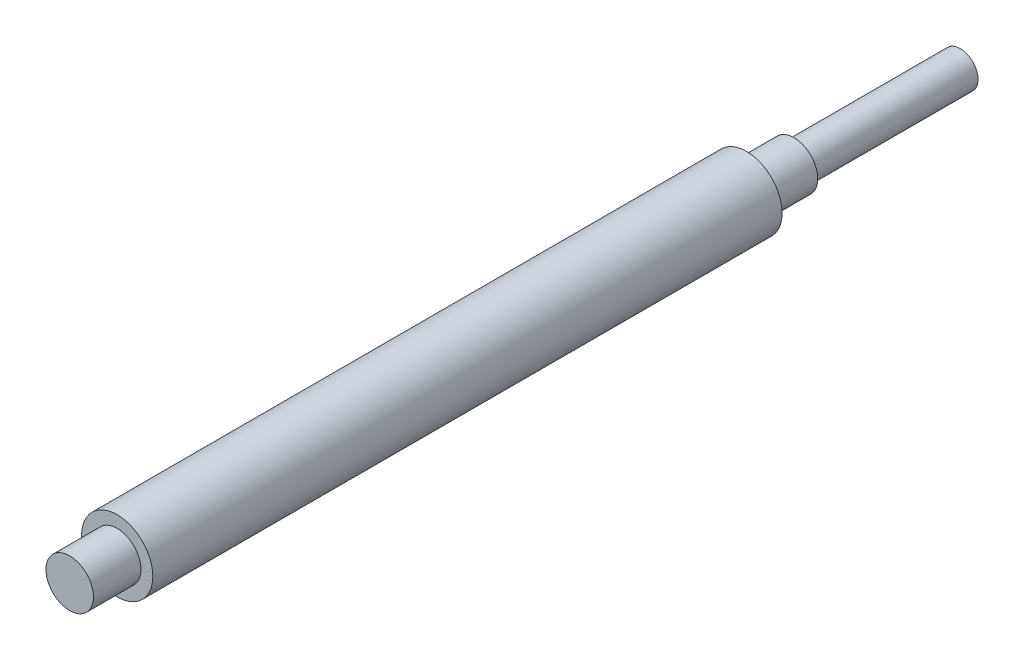
ISO-10303-21;
HEADER;
FILE_DESCRIPTION(('STEP AP214'),'2;1');
FILE_NAME('part.step','',(''),(''),'','','');
FILE_SCHEMA(('AUTOMOTIVE_DESIGN { 1 0 10303 214 1 1 1 1 }'));
ENDSEC;
DATA;
#1=APPLICATION_CONTEXT('core data for automotive mechanical design processes');
#2=APPLICATION_PROTOCOL_DEFINITION('international standard','automotive_design',2000,#1);
#3=PRODUCT_CONTEXT('',#1,'mechanical');
#4=PRODUCT('Part','Part','',(#3));
#5=PRODUCT_RELATED_PRODUCT_CATEGORY('part','',(#4));
#6=PRODUCT_DEFINITION_FORMATION('','',#4);
#7=PRODUCT_DEFINITION_CONTEXT('part definition',#1,'design');
#8=PRODUCT_DEFINITION('design','',#6,#7);
#9=PRODUCT_DEFINITION_SHAPE('','',#8);
#10=(LENGTH_UNIT() NAMED_UNIT(*) SI_UNIT(.MILLI.,.METRE.));
#11=(NAMED_UNIT(*) PLANE_ANGLE_UNIT() SI_UNIT($,.RADIAN.));
#12=(NAMED_UNIT(*) SI_UNIT($,.STERADIAN.) SOLID_ANGLE_UNIT());
#13=UNCERTAINTY_MEASURE_WITH_UNIT(LENGTH_MEASURE(1.E-05),#10,'distance_accuracy_value','');
#14=(GEOMETRIC_REPRESENTATION_CONTEXT(3) GLOBAL_UNCERTAINTY_ASSIGNED_CONTEXT((#13)) GLOBAL_UNIT_ASSIGNED_CONTEXT((#10,
#11,#12)) REPRESENTATION_CONTEXT('',''));
#15=CARTESIAN_POINT('',(0.,0.,0.));
#16=DIRECTION('',(0.,0.,1.));
#17=DIRECTION('',(1.,0.,0.));
#18=AXIS2_PLACEMENT_3D('',#15,#16,#17);
#19=CARTESIAN_POINT('',(0.,0.,75.));
#20=DIRECTION('',(0.,0.,-1.));
#21=DIRECTION('',(-1.,0.,0.));
#22=AXIS2_PLACEMENT_3D('',#19,#20,#21);
#23=CYLINDRICAL_SURFACE('',#22,3.);
#24=CARTESIAN_POINT('',(0.,0.,18.));
#25=DIRECTION('',(0.,0.,1.));
#26=DIRECTION('',(1.,0.,0.));
#27=AXIS2_PLACEMENT_3D('',#24,#25,#26);
#28=CIRCLE('',#27,3.);
#29=CARTESIAN_POINT('',(3.,0.,18.));
#30=VERTEX_POINT('',#29);
#31=EDGE_CURVE('E60',#30,#30,#28,.F.);
#32=ORIENTED_EDGE('',*,*,#31,.F.);
#33=EDGE_LOOP('',(#32));
#34=FACE_BOUND('',#33,.T.);
#35=CARTESIAN_POINT('',(0.,0.,71.));
#36=DIRECTION('',(0.,0.,1.));
#37=DIRECTION('',(1.,0.,0.));
#38=AXIS2_PLACEMENT_3D('',#35,#36,#37);
#39=CIRCLE('',#38,3.);
#40=CARTESIAN_POINT('',(3.,0.,71.));
#41=VERTEX_POINT('',#40);
#42=EDGE_CURVE('E12',#41,#41,#39,.T.);
#43=ORIENTED_EDGE('',*,*,#42,.F.);
#44=EDGE_LOOP('',(#43));
#45=FACE_BOUND('',#44,.T.);
#46=ADVANCED_FACE('F40',(#34,#45),#23,.T.);
#47=CARTESIAN_POINT('',(0.,0.,71.));
#48=DIRECTION('',(0.,0.,1.));
#49=DIRECTION('',(1.,0.,0.));
#50=AXIS2_PLACEMENT_3D('',#47,#48,#49);
#51=PLANE('',#50);
#52=CARTESIAN_POINT('',(0.,0.,71.));
#53=DIRECTION('',(0.,0.,1.));
#54=DIRECTION('',(1.,0.,0.));
#55=AXIS2_PLACEMENT_3D('',#52,#53,#54);
#56=CIRCLE('',#55,2.);
#57=CARTESIAN_POINT('',(2.,0.,71.));
#58=VERTEX_POINT('',#57);
#59=EDGE_CURVE('E48',#58,#58,#56,.T.);
#60=ORIENTED_EDGE('',*,*,#59,.F.);
#61=EDGE_LOOP('',(#60));
#62=FACE_BOUND('',#61,.T.);
#63=ORIENTED_EDGE('',*,*,#42,.T.);
#64=EDGE_LOOP('',(#63));
#65=FACE_BOUND('',#64,.T.);
#66=ADVANCED_FACE('F95',(#62,#65),#51,.T.);
#67=CARTESIAN_POINT('',(0.,0.,71.));
#68=DIRECTION('',(0.,0.,1.));
#69=DIRECTION('',(1.,0.,0.));
#70=AXIS2_PLACEMENT_3D('',#67,#68,#69);
#71=CYLINDRICAL_SURFACE('',#70,2.);
#72=ORIENTED_EDGE('',*,*,#59,.T.);
#73=EDGE_LOOP('',(#72));
#74=FACE_BOUND('',#73,.T.);
#75=CARTESIAN_POINT('',(0.,0.,75.));
#76=DIRECTION('',(0.,0.,1.));
#77=DIRECTION('',(1.,0.,0.));
#78=AXIS2_PLACEMENT_3D('',#75,#76,#77);
#79=CIRCLE('',#78,2.);
#80=CARTESIAN_POINT('',(2.,0.,75.));
#81=VERTEX_POINT('',#80);
#82=EDGE_CURVE('E53',#81,#81,#79,.T.);
#83=ORIENTED_EDGE('',*,*,#82,.F.);
#84=EDGE_LOOP('',(#83));
#85=FACE_BOUND('',#84,.T.);
#86=ADVANCED_FACE('F100',(#74,#85),#71,.T.);
#87=CARTESIAN_POINT('',(0.,0.,75.));
#88=DIRECTION('',(0.,0.,1.));
#89=DIRECTION('',(1.,0.,0.));
#90=AXIS2_PLACEMENT_3D('',#87,#88,#89);
#91=PLANE('',#90);
#92=ORIENTED_EDGE('',*,*,#82,.T.);
#93=EDGE_LOOP('',(#92));
#94=FACE_BOUND('',#93,.T.);
#95=ADVANCED_FACE('F113',(#94),#91,.T.);
#96=CARTESIAN_POINT('',(0.,0.,79.4852813742386));
#97=DIRECTION('',(0.,0.,-1.));
#98=DIRECTION('',(-1.,0.,0.));
#99=AXIS2_PLACEMENT_3D('',#96,#97,#98);
#100=CYLINDRICAL_SURFACE('',#99,2.);
#101=CARTESIAN_POINT('',(0.,0.,14.));
#102=DIRECTION('',(0.,0.,1.));
#103=DIRECTION('',(1.,0.,0.));
#104=AXIS2_PLACEMENT_3D('',#101,#102,#103);
#105=CIRCLE('',#104,2.);
#106=CARTESIAN_POINT('',(2.,0.,14.));
#107=VERTEX_POINT('',#106);
#108=EDGE_CURVE('E43',#107,#107,#105,.F.);
#109=ORIENTED_EDGE('',*,*,#108,.F.);
#110=EDGE_LOOP('',(#109));
#111=FACE_BOUND('',#110,.T.);
#112=CARTESIAN_POINT('',(0.,0.,18.));
#113=DIRECTION('',(0.,0.,1.));
#114=DIRECTION('',(1.,0.,0.));
#115=AXIS2_PLACEMENT_3D('',#112,#113,#114);
#116=CIRCLE('',#115,2.);
#117=CARTESIAN_POINT('',(2.,0.,18.));
#118=VERTEX_POINT('',#117);
#119=EDGE_CURVE('E58',#118,#118,#116,.F.);
#120=ORIENTED_EDGE('',*,*,#119,.T.);
#121=EDGE_LOOP('',(#120));
#122=FACE_BOUND('',#121,.T.);
#123=ADVANCED_FACE('F108',(#111,#122),#100,.T.);
#124=CARTESIAN_POINT('',(0.,0.,18.));
#125=DIRECTION('',(0.,0.,1.));
#126=DIRECTION('',(1.,0.,0.));
#127=AXIS2_PLACEMENT_3D('',#124,#125,#126);
#128=PLANE('',#127);
#129=ORIENTED_EDGE('',*,*,#31,.T.);
#130=EDGE_LOOP('',(#129));
#131=FACE_BOUND('',#130,.T.);
#132=ORIENTED_EDGE('',*,*,#119,.F.);
#133=EDGE_LOOP('',(#132));
#134=FACE_BOUND('',#133,.T.);
#135=ADVANCED_FACE('F82',(#131,#134),#128,.F.);
#136=CARTESIAN_POINT('',(0.,0.,25.0710678118655));
#137=DIRECTION('',(0.,0.,-1.));
#138=DIRECTION('',(-1.,0.,0.));
#139=AXIS2_PLACEMENT_3D('',#136,#137,#138);
#140=CYLINDRICAL_SURFACE('',#139,1.5);
#141=CARTESIAN_POINT('',(0.,0.,0.));
#142=DIRECTION('',(0.,0.,-1.));
#143=DIRECTION('',(-1.,0.,0.));
#144=AXIS2_PLACEMENT_3D('',#141,#142,#143);
#145=CIRCLE('',#144,1.5);
#146=CARTESIAN_POINT('',(-1.5,0.,0.));
#147=VERTEX_POINT('',#146);
#148=EDGE_CURVE('E71',#147,#147,#145,.T.);
#149=ORIENTED_EDGE('',*,*,#148,.F.);
#150=EDGE_LOOP('',(#149));
#151=FACE_BOUND('',#150,.T.);
#152=CARTESIAN_POINT('',(0.,0.,14.));
#153=DIRECTION('',(0.,0.,1.));
#154=DIRECTION('',(1.,0.,0.));
#155=AXIS2_PLACEMENT_3D('',#152,#153,#154);
#156=CIRCLE('',#155,1.5);
#157=CARTESIAN_POINT('',(1.5,0.,14.));
#158=VERTEX_POINT('',#157);
#159=EDGE_CURVE('E67',#158,#158,#156,.F.);
#160=ORIENTED_EDGE('',*,*,#159,.T.);
#161=EDGE_LOOP('',(#160));
#162=FACE_BOUND('',#161,.T.);
#163=ADVANCED_FACE('F78',(#151,#162),#140,.T.);
#164=CARTESIAN_POINT('',(0.,0.,14.));
#165=DIRECTION('',(0.,0.,1.));
#166=DIRECTION('',(1.,0.,0.));
#167=AXIS2_PLACEMENT_3D('',#164,#165,#166);
#168=PLANE('',#167);
#169=ORIENTED_EDGE('',*,*,#108,.T.);
#170=EDGE_LOOP('',(#169));
#171=FACE_BOUND('',#170,.T.);
#172=ORIENTED_EDGE('',*,*,#159,.F.);
#173=EDGE_LOOP('',(#172));
#174=FACE_BOUND('',#173,.T.);
#175=ADVANCED_FACE('F81',(#171,#174),#168,.F.);
#176=CARTESIAN_POINT('',(0.,0.,0.));
#177=DIRECTION('',(0.,0.,1.));
#178=DIRECTION('',(1.,0.,0.));
#179=AXIS2_PLACEMENT_3D('',#176,#177,#178);
#180=PLANE('',#179);
#181=ORIENTED_EDGE('',*,*,#148,.T.);
#182=EDGE_LOOP('',(#181));
#183=FACE_BOUND('',#182,.T.);
#184=ADVANCED_FACE('F76',(#183),#180,.F.);
#185=CLOSED_SHELL('',(#46,#66,#86,#95,#123,#135,#163,#175,#184));
#186=MANIFOLD_SOLID_BREP('B2',#185);
#187=ADVANCED_BREP_SHAPE_REPRESENTATION('',(#18,#186),#14);
#188=SHAPE_DEFINITION_REPRESENTATION(#9,#187);
ENDSEC;
END-ISO-10303-21;
